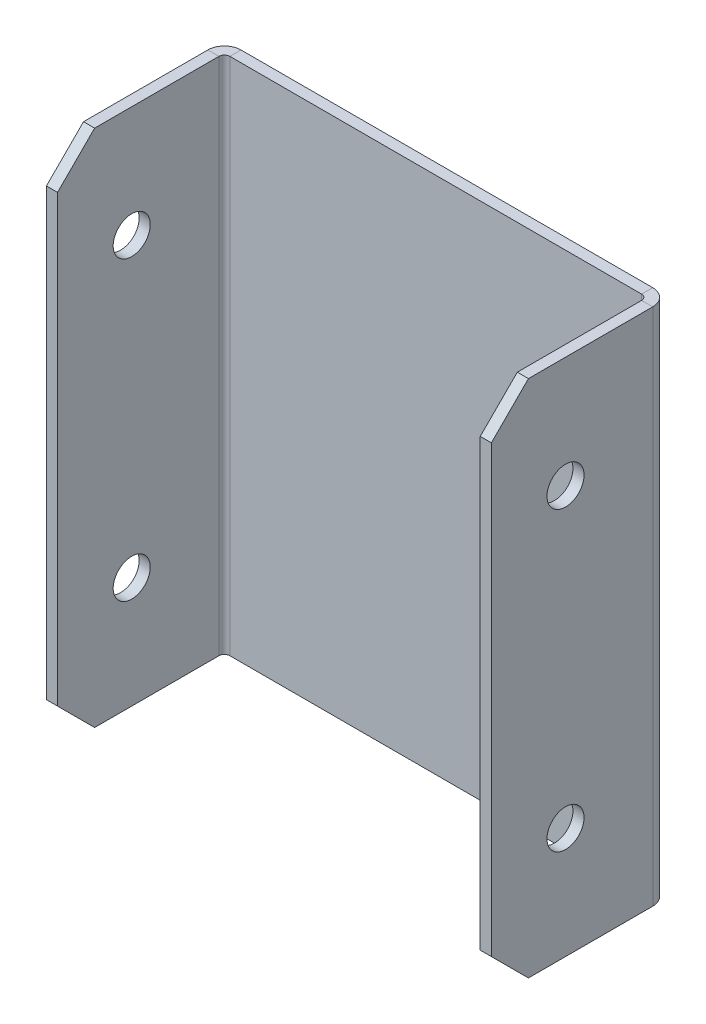
ISO-10303-21;
HEADER;
FILE_DESCRIPTION(('STEP AP214'),'2;1');
FILE_NAME('part.step','',(''),(''),'','','');
FILE_SCHEMA(('AUTOMOTIVE_DESIGN { 1 0 10303 214 1 1 1 1 }'));
ENDSEC;
DATA;
#1=APPLICATION_CONTEXT('core data for automotive mechanical design processes');
#2=APPLICATION_PROTOCOL_DEFINITION('international standard','automotive_design',2000,#1);
#3=PRODUCT_CONTEXT('',#1,'mechanical');
#4=PRODUCT('Part','Part','',(#3));
#5=PRODUCT_RELATED_PRODUCT_CATEGORY('part','',(#4));
#6=PRODUCT_DEFINITION_FORMATION('','',#4);
#7=PRODUCT_DEFINITION_CONTEXT('part definition',#1,'design');
#8=PRODUCT_DEFINITION('design','',#6,#7);
#9=PRODUCT_DEFINITION_SHAPE('','',#8);
#10=(LENGTH_UNIT() NAMED_UNIT(*) SI_UNIT(.MILLI.,.METRE.));
#11=(NAMED_UNIT(*) PLANE_ANGLE_UNIT() SI_UNIT($,.RADIAN.));
#12=(NAMED_UNIT(*) SI_UNIT($,.STERADIAN.) SOLID_ANGLE_UNIT());
#13=UNCERTAINTY_MEASURE_WITH_UNIT(LENGTH_MEASURE(1.E-05),#10,'distance_accuracy_value','');
#14=(GEOMETRIC_REPRESENTATION_CONTEXT(3) GLOBAL_UNCERTAINTY_ASSIGNED_CONTEXT((#13)) GLOBAL_UNIT_ASSIGNED_CONTEXT((#10,
#11,#12)) REPRESENTATION_CONTEXT('',''));
#15=CARTESIAN_POINT('',(0.,0.,0.));
#16=DIRECTION('',(0.,0.,1.));
#17=DIRECTION('',(1.,0.,0.));
#18=AXIS2_PLACEMENT_3D('',#15,#16,#17);
#19=CARTESIAN_POINT('',(0.,0.,-1.5));
#20=DIRECTION('',(0.,0.,-1.));
#21=DIRECTION('',(-1.,0.,0.));
#22=AXIS2_PLACEMENT_3D('',#19,#20,#21);
#23=PLANE('',#22);
#24=DIRECTION('',(-1.,0.,0.));
#25=VECTOR('',#24,1.);
#26=CARTESIAN_POINT('',(-30.,35.,-1.5));
#27=LINE('',#26,#25);
#28=CARTESIAN_POINT('',(27.7634,35.,-1.5));
#29=VERTEX_POINT('',#28);
#30=CARTESIAN_POINT('',(-27.7634,35.,-1.5));
#31=VERTEX_POINT('',#30);
#32=EDGE_CURVE('E310',#29,#31,#27,.T.);
#33=ORIENTED_EDGE('',*,*,#32,.F.);
#34=DIRECTION('',(0.,1.,0.));
#35=VECTOR('',#34,1.);
#36=CARTESIAN_POINT('',(27.7634,35.,-1.5));
#37=LINE('',#36,#35);
#38=CARTESIAN_POINT('',(27.7634,-35.,-1.5));
#39=VERTEX_POINT('',#38);
#40=EDGE_CURVE('E203',#29,#39,#37,.F.);
#41=ORIENTED_EDGE('',*,*,#40,.T.);
#42=DIRECTION('',(1.,0.,0.));
#43=VECTOR('',#42,1.);
#44=CARTESIAN_POINT('',(-30.,-35.,-1.5));
#45=LINE('',#44,#43);
#46=CARTESIAN_POINT('',(-27.7634,-35.,-1.5));
#47=VERTEX_POINT('',#46);
#48=EDGE_CURVE('E313',#47,#39,#45,.T.);
#49=ORIENTED_EDGE('',*,*,#48,.F.);
#50=DIRECTION('',(0.,-1.,0.));
#51=VECTOR('',#50,1.);
#52=CARTESIAN_POINT('',(-27.7634,-35.,-1.5));
#53=LINE('',#52,#51);
#54=EDGE_CURVE('E287',#47,#31,#53,.F.);
#55=ORIENTED_EDGE('',*,*,#54,.T.);
#56=EDGE_LOOP('',(#33,#41,#49,#55));
#57=FACE_BOUND('',#56,.T.);
#58=ADVANCED_FACE('F80',(#57),#23,.T.);
#59=CARTESIAN_POINT('',(0.,0.,0.));
#60=DIRECTION('',(0.,0.,-1.));
#61=DIRECTION('',(-1.,0.,0.));
#62=AXIS2_PLACEMENT_3D('',#59,#60,#61);
#63=PLANE('',#62);
#64=DIRECTION('',(0.,1.,0.));
#65=VECTOR('',#64,1.);
#66=CARTESIAN_POINT('',(27.7634,35.,0.));
#67=LINE('',#66,#65);
#68=CARTESIAN_POINT('',(27.7634,35.,0.));
#69=VERTEX_POINT('',#68);
#70=CARTESIAN_POINT('',(27.7634,-35.,0.));
#71=VERTEX_POINT('',#70);
#72=EDGE_CURVE('E254',#69,#71,#67,.F.);
#73=ORIENTED_EDGE('',*,*,#72,.F.);
#74=DIRECTION('',(-1.,0.,0.));
#75=VECTOR('',#74,1.);
#76=CARTESIAN_POINT('',(-30.,35.,0.));
#77=LINE('',#76,#75);
#78=CARTESIAN_POINT('',(-27.7634,35.,0.));
#79=VERTEX_POINT('',#78);
#80=EDGE_CURVE('E307',#69,#79,#77,.T.);
#81=ORIENTED_EDGE('',*,*,#80,.T.);
#82=DIRECTION('',(0.,-1.,0.));
#83=VECTOR('',#82,1.);
#84=CARTESIAN_POINT('',(-27.7634,-35.,0.));
#85=LINE('',#84,#83);
#86=CARTESIAN_POINT('',(-27.7634,-35.,0.));
#87=VERTEX_POINT('',#86);
#88=EDGE_CURVE('E300',#87,#79,#85,.F.);
#89=ORIENTED_EDGE('',*,*,#88,.F.);
#90=DIRECTION('',(1.,0.,0.));
#91=VECTOR('',#90,1.);
#92=CARTESIAN_POINT('',(-30.,-35.,0.));
#93=LINE('',#92,#91);
#94=EDGE_CURVE('E314',#87,#71,#93,.T.);
#95=ORIENTED_EDGE('',*,*,#94,.T.);
#96=EDGE_LOOP('',(#73,#81,#89,#95));
#97=FACE_BOUND('',#96,.T.);
#98=ADVANCED_FACE('F415',(#97),#63,.F.);
#99=CARTESIAN_POINT('',(-30.,35.,-1.5));
#100=DIRECTION('',(0.,1.,0.));
#101=DIRECTION('',(0.,0.,1.));
#102=AXIS2_PLACEMENT_3D('',#99,#100,#101);
#103=PLANE('',#102);
#104=ORIENTED_EDGE('',*,*,#80,.F.);
#105=DIRECTION('',(0.,0.,-1.));
#106=VECTOR('',#105,1.);
#107=CARTESIAN_POINT('',(27.7634,35.,0.));
#108=LINE('',#107,#106);
#109=EDGE_CURVE('E250',#69,#29,#108,.T.);
#110=ORIENTED_EDGE('',*,*,#109,.T.);
#111=ORIENTED_EDGE('',*,*,#32,.T.);
#112=DIRECTION('',(0.,0.,-1.));
#113=VECTOR('',#112,1.);
#114=CARTESIAN_POINT('',(-27.7634,35.,0.));
#115=LINE('',#114,#113);
#116=EDGE_CURVE('E304',#79,#31,#115,.T.);
#117=ORIENTED_EDGE('',*,*,#116,.F.);
#118=EDGE_LOOP('',(#104,#110,#111,#117));
#119=FACE_BOUND('',#118,.T.);
#120=ADVANCED_FACE('F421',(#119),#103,.T.);
#121=CARTESIAN_POINT('',(-30.,-35.,-1.5));
#122=DIRECTION('',(0.,-1.,0.));
#123=DIRECTION('',(0.,0.,-1.));
#124=AXIS2_PLACEMENT_3D('',#121,#122,#123);
#125=PLANE('',#124);
#126=DIRECTION('',(0.,0.,-1.));
#127=VECTOR('',#126,1.);
#128=CARTESIAN_POINT('',(27.7634,-35.,0.));
#129=LINE('',#128,#127);
#130=EDGE_CURVE('E257',#71,#39,#129,.T.);
#131=ORIENTED_EDGE('',*,*,#130,.F.);
#132=ORIENTED_EDGE('',*,*,#94,.F.);
#133=DIRECTION('',(0.,0.,-1.));
#134=VECTOR('',#133,1.);
#135=CARTESIAN_POINT('',(-27.7634,-35.,0.));
#136=LINE('',#135,#134);
#137=EDGE_CURVE('E294',#87,#47,#136,.T.);
#138=ORIENTED_EDGE('',*,*,#137,.T.);
#139=ORIENTED_EDGE('',*,*,#48,.T.);
#140=EDGE_LOOP('',(#131,#132,#138,#139));
#141=FACE_BOUND('',#140,.T.);
#142=ADVANCED_FACE('F429',(#141),#125,.T.);
#143=CARTESIAN_POINT('',(-27.7634,35.,0.7366));
#144=DIRECTION('',(0.,1.,0.));
#145=DIRECTION('',(0.,0.,1.));
#146=AXIS2_PLACEMENT_3D('',#143,#144,#145);
#147=PLANE('',#146);
#148=DIRECTION('',(1.,0.,0.));
#149=VECTOR('',#148,1.);
#150=CARTESIAN_POINT('',(-30.,35.,0.736599999999992));
#151=LINE('',#150,#149);
#152=CARTESIAN_POINT('',(-28.5,35.,0.736599999999997));
#153=VERTEX_POINT('',#152);
#154=CARTESIAN_POINT('',(-30.,35.,0.736599999999992));
#155=VERTEX_POINT('',#154);
#156=EDGE_CURVE('E260',#153,#155,#151,.F.);
#157=ORIENTED_EDGE('',*,*,#156,.F.);
#158=CARTESIAN_POINT('',(-27.7634,35.,0.7366));
#159=DIRECTION('',(0.,-1.,0.));
#160=DIRECTION('',(0.,0.,-1.));
#161=AXIS2_PLACEMENT_3D('',#158,#159,#160);
#162=CIRCLE('',#161,0.7366);
#163=EDGE_CURVE('E297',#79,#153,#162,.F.);
#164=ORIENTED_EDGE('',*,*,#163,.F.);
#165=ORIENTED_EDGE('',*,*,#116,.T.);
#166=CARTESIAN_POINT('',(-27.7634,35.,0.7366));
#167=DIRECTION('',(0.,-1.,0.));
#168=DIRECTION('',(0.,0.,-1.));
#169=AXIS2_PLACEMENT_3D('',#166,#167,#168);
#170=CIRCLE('',#169,2.2366);
#171=EDGE_CURVE('E290',#31,#155,#170,.F.);
#172=ORIENTED_EDGE('',*,*,#171,.T.);
#173=EDGE_LOOP('',(#157,#164,#165,#172));
#174=FACE_BOUND('',#173,.T.);
#175=ADVANCED_FACE('F432',(#174),#147,.T.);
#176=CARTESIAN_POINT('',(-27.7634,-35.,0.7366));
#177=DIRECTION('',(0.,1.,0.));
#178=DIRECTION('',(0.,0.,1.));
#179=AXIS2_PLACEMENT_3D('',#176,#177,#178);
#180=PLANE('',#179);
#181=CARTESIAN_POINT('',(-27.7634,-35.,0.7366));
#182=DIRECTION('',(0.,-1.,0.));
#183=DIRECTION('',(0.,0.,-1.));
#184=AXIS2_PLACEMENT_3D('',#181,#182,#183);
#185=CIRCLE('',#184,0.7366);
#186=CARTESIAN_POINT('',(-28.5,-35.,0.736599999999997));
#187=VERTEX_POINT('',#186);
#188=EDGE_CURVE('E264',#187,#87,#185,.T.);
#189=ORIENTED_EDGE('',*,*,#188,.F.);
#190=DIRECTION('',(1.,0.,0.));
#191=VECTOR('',#190,1.);
#192=CARTESIAN_POINT('',(-28.5,-35.,0.736599999999997));
#193=LINE('',#192,#191);
#194=CARTESIAN_POINT('',(-30.,-35.,0.736599999999992));
#195=VERTEX_POINT('',#194);
#196=EDGE_CURVE('E280',#187,#195,#193,.F.);
#197=ORIENTED_EDGE('',*,*,#196,.T.);
#198=CARTESIAN_POINT('',(-27.7634,-35.,0.7366));
#199=DIRECTION('',(0.,-1.,0.));
#200=DIRECTION('',(0.,0.,-1.));
#201=AXIS2_PLACEMENT_3D('',#198,#199,#200);
#202=CIRCLE('',#201,2.2366);
#203=EDGE_CURVE('E291',#195,#47,#202,.T.);
#204=ORIENTED_EDGE('',*,*,#203,.T.);
#205=ORIENTED_EDGE('',*,*,#137,.F.);
#206=EDGE_LOOP('',(#189,#197,#204,#205));
#207=FACE_BOUND('',#206,.T.);
#208=ADVANCED_FACE('F426',(#207),#180,.F.);
#209=CARTESIAN_POINT('',(-27.7634,-35.,0.7366));
#210=DIRECTION('',(0.,-1.,0.));
#211=DIRECTION('',(-1.,0.,0.));
#212=AXIS2_PLACEMENT_3D('',#209,#210,#211);
#213=CYLINDRICAL_SURFACE('',#212,2.2366);
#214=ORIENTED_EDGE('',*,*,#54,.F.);
#215=ORIENTED_EDGE('',*,*,#203,.F.);
#216=DIRECTION('',(0.,-1.,0.));
#217=VECTOR('',#216,1.);
#218=CARTESIAN_POINT('',(-30.,35.,0.736599999999992));
#219=LINE('',#218,#217);
#220=EDGE_CURVE('E277',#195,#155,#219,.F.);
#221=ORIENTED_EDGE('',*,*,#220,.T.);
#222=ORIENTED_EDGE('',*,*,#171,.F.);
#223=EDGE_LOOP('',(#214,#215,#221,#222));
#224=FACE_BOUND('',#223,.T.);
#225=ADVANCED_FACE('F462',(#224),#213,.T.);
#226=CARTESIAN_POINT('',(-27.7634,-35.,0.7366));
#227=DIRECTION('',(0.,-1.,0.));
#228=DIRECTION('',(-1.,0.,0.));
#229=AXIS2_PLACEMENT_3D('',#226,#227,#228);
#230=CYLINDRICAL_SURFACE('',#229,0.7366);
#231=ORIENTED_EDGE('',*,*,#88,.T.);
#232=ORIENTED_EDGE('',*,*,#163,.T.);
#233=DIRECTION('',(0.,-1.,0.));
#234=VECTOR('',#233,1.);
#235=CARTESIAN_POINT('',(-28.5,35.,0.736599999999997));
#236=LINE('',#235,#234);
#237=EDGE_CURVE('E283',#153,#187,#236,.T.);
#238=ORIENTED_EDGE('',*,*,#237,.T.);
#239=ORIENTED_EDGE('',*,*,#188,.T.);
#240=EDGE_LOOP('',(#231,#232,#238,#239));
#241=FACE_BOUND('',#240,.T.);
#242=ADVANCED_FACE('F482',(#241),#230,.F.);
#243=CARTESIAN_POINT('',(-30.0000000000001,-35.,22.5));
#244=DIRECTION('',(0.,1.,0.));
#245=DIRECTION('',(0.,0.,1.));
#246=AXIS2_PLACEMENT_3D('',#243,#244,#245);
#247=PLANE('',#246);
#248=DIRECTION('',(0.,0.,-1.));
#249=VECTOR('',#248,1.);
#250=CARTESIAN_POINT('',(-28.5000000000001,-35.,22.5));
#251=LINE('',#250,#249);
#252=CARTESIAN_POINT('',(-28.5000000000001,-35.,17.5));
#253=VERTEX_POINT('',#252);
#254=EDGE_CURVE('E274',#187,#253,#251,.F.);
#255=ORIENTED_EDGE('',*,*,#254,.T.);
#256=DIRECTION('',(-1.,0.,0.));
#257=VECTOR('',#256,1.);
#258=CARTESIAN_POINT('',(-30.0000000000001,-35.,17.5));
#259=LINE('',#258,#257);
#260=CARTESIAN_POINT('',(-30.0000000000001,-35.,17.5));
#261=VERTEX_POINT('',#260);
#262=EDGE_CURVE('E326',#253,#261,#259,.T.);
#263=ORIENTED_EDGE('',*,*,#262,.T.);
#264=DIRECTION('',(0.,0.,1.));
#265=VECTOR('',#264,1.);
#266=CARTESIAN_POINT('',(-30.,-35.,-1.11633595201509E-13));
#267=LINE('',#266,#265);
#268=EDGE_CURVE('E267',#195,#261,#267,.T.);
#269=ORIENTED_EDGE('',*,*,#268,.F.);
#270=ORIENTED_EDGE('',*,*,#196,.F.);
#271=EDGE_LOOP('',(#255,#263,#269,#270));
#272=FACE_BOUND('',#271,.T.);
#273=ADVANCED_FACE('F474',(#272),#247,.F.);
#274=CARTESIAN_POINT('',(-30.,35.,0.));
#275=DIRECTION('',(0.,-1.,0.));
#276=DIRECTION('',(0.,0.,-1.));
#277=AXIS2_PLACEMENT_3D('',#274,#275,#276);
#278=PLANE('',#277);
#279=DIRECTION('',(0.,0.,-1.));
#280=VECTOR('',#279,1.);
#281=CARTESIAN_POINT('',(-30.,35.,-1.11633595201509E-13));
#282=LINE('',#281,#280);
#283=CARTESIAN_POINT('',(-30.0000000000001,35.,17.5));
#284=VERTEX_POINT('',#283);
#285=EDGE_CURVE('E262',#284,#155,#282,.T.);
#286=ORIENTED_EDGE('',*,*,#285,.F.);
#287=DIRECTION('',(1.,0.,0.));
#288=VECTOR('',#287,1.);
#289=CARTESIAN_POINT('',(-30.0000000000001,35.,17.5));
#290=LINE('',#289,#288);
#291=CARTESIAN_POINT('',(-28.5000000000001,35.,17.5));
#292=VERTEX_POINT('',#291);
#293=EDGE_CURVE('E349',#284,#292,#290,.T.);
#294=ORIENTED_EDGE('',*,*,#293,.T.);
#295=DIRECTION('',(0.,0.,1.));
#296=VECTOR('',#295,1.);
#297=CARTESIAN_POINT('',(-28.5,35.,0.));
#298=LINE('',#297,#296);
#299=EDGE_CURVE('E270',#292,#153,#298,.F.);
#300=ORIENTED_EDGE('',*,*,#299,.T.);
#301=ORIENTED_EDGE('',*,*,#156,.T.);
#302=EDGE_LOOP('',(#286,#294,#300,#301));
#303=FACE_BOUND('',#302,.T.);
#304=ADVANCED_FACE('F487',(#303),#278,.F.);
#305=CARTESIAN_POINT('',(-30.,0.,-1.11633595201509E-13));
#306=DIRECTION('',(1.,0.,0.));
#307=DIRECTION('',(0.,0.,-1.));
#308=AXIS2_PLACEMENT_3D('',#305,#306,#307);
#309=PLANE('',#308);
#310=CARTESIAN_POINT('',(-30.0000000000001,-20.,12.5000000000002));
#311=DIRECTION('',(1.,0.,0.));
#312=DIRECTION('',(0.,0.,-1.));
#313=AXIS2_PLACEMENT_3D('',#310,#311,#312);
#314=CIRCLE('',#313,2.5);
#315=CARTESIAN_POINT('',(-30.0000000000001,-20.,10.0000000000002));
#316=VERTEX_POINT('',#315);
#317=EDGE_CURVE('E356',#316,#316,#314,.T.);
#318=ORIENTED_EDGE('',*,*,#317,.T.);
#319=EDGE_LOOP('',(#318));
#320=FACE_BOUND('',#319,.T.);
#321=CARTESIAN_POINT('',(-30.0000000000001,20.,12.5000000000002));
#322=DIRECTION('',(1.,0.,0.));
#323=DIRECTION('',(0.,0.,-1.));
#324=AXIS2_PLACEMENT_3D('',#321,#322,#323);
#325=CIRCLE('',#324,2.5);
#326=CARTESIAN_POINT('',(-30.0000000000001,20.,10.0000000000002));
#327=VERTEX_POINT('',#326);
#328=EDGE_CURVE('E367',#327,#327,#325,.T.);
#329=ORIENTED_EDGE('',*,*,#328,.T.);
#330=EDGE_LOOP('',(#329));
#331=FACE_BOUND('',#330,.T.);
#332=DIRECTION('',(0.,1.,0.));
#333=VECTOR('',#332,1.);
#334=CARTESIAN_POINT('',(-30.0000000000001,0.,22.5));
#335=LINE('',#334,#333);
#336=CARTESIAN_POINT('',(-30.0000000000001,-30.,22.5));
#337=VERTEX_POINT('',#336);
#338=CARTESIAN_POINT('',(-30.0000000000001,30.,22.5));
#339=VERTEX_POINT('',#338);
#340=EDGE_CURVE('E265',#337,#339,#335,.T.);
#341=ORIENTED_EDGE('',*,*,#340,.T.);
#342=DIRECTION('',(0.,-0.707106781186548,0.707106781186548));
#343=VECTOR('',#342,1.);
#344=CARTESIAN_POINT('',(-30.0000000000001,35.,17.5));
#345=LINE('',#344,#343);
#346=EDGE_CURVE('E13',#339,#284,#345,.F.);
#347=ORIENTED_EDGE('',*,*,#346,.T.);
#348=ORIENTED_EDGE('',*,*,#285,.T.);
#349=ORIENTED_EDGE('',*,*,#220,.F.);
#350=ORIENTED_EDGE('',*,*,#268,.T.);
#351=DIRECTION('',(0.,-0.707106781186547,-0.707106781186548));
#352=VECTOR('',#351,1.);
#353=CARTESIAN_POINT('',(-30.0000000000001,-30.,22.5));
#354=LINE('',#353,#352);
#355=EDGE_CURVE('E328',#261,#337,#354,.F.);
#356=ORIENTED_EDGE('',*,*,#355,.T.);
#357=EDGE_LOOP('',(#341,#347,#348,#349,#350,#356));
#358=FACE_BOUND('',#357,.T.);
#359=ADVANCED_FACE('F471',(#320,#331,#358),#309,.F.);
#360=CARTESIAN_POINT('',(-28.5,0.,-1.06396373193244E-13));
#361=DIRECTION('',(1.,0.,0.));
#362=DIRECTION('',(0.,0.,-1.));
#363=AXIS2_PLACEMENT_3D('',#360,#361,#362);
#364=PLANE('',#363);
#365=CARTESIAN_POINT('',(-28.5000000000001,-20.,12.5000000000002));
#366=DIRECTION('',(1.,0.,0.));
#367=DIRECTION('',(0.,0.,-1.));
#368=AXIS2_PLACEMENT_3D('',#365,#366,#367);
#369=CIRCLE('',#368,2.5);
#370=CARTESIAN_POINT('',(-28.5,-20.,10.0000000000002));
#371=VERTEX_POINT('',#370);
#372=EDGE_CURVE('E247',#371,#371,#369,.T.);
#373=ORIENTED_EDGE('',*,*,#372,.F.);
#374=EDGE_LOOP('',(#373));
#375=FACE_BOUND('',#374,.T.);
#376=CARTESIAN_POINT('',(-28.5000000000001,20.,12.5000000000002));
#377=DIRECTION('',(1.,0.,0.));
#378=DIRECTION('',(0.,0.,-1.));
#379=AXIS2_PLACEMENT_3D('',#376,#377,#378);
#380=CIRCLE('',#379,2.5);
#381=CARTESIAN_POINT('',(-28.5,20.,10.0000000000002));
#382=VERTEX_POINT('',#381);
#383=EDGE_CURVE('E355',#382,#382,#380,.T.);
#384=ORIENTED_EDGE('',*,*,#383,.F.);
#385=EDGE_LOOP('',(#384));
#386=FACE_BOUND('',#385,.T.);
#387=ORIENTED_EDGE('',*,*,#299,.F.);
#388=DIRECTION('',(0.,0.707106781186548,-0.707106781186548));
#389=VECTOR('',#388,1.);
#390=CARTESIAN_POINT('',(-28.5000000000001,26.25,26.2499999999999));
#391=LINE('',#390,#389);
#392=CARTESIAN_POINT('',(-28.5000000000001,30.,22.5));
#393=VERTEX_POINT('',#392);
#394=EDGE_CURVE('E105',#292,#393,#391,.F.);
#395=ORIENTED_EDGE('',*,*,#394,.T.);
#396=DIRECTION('',(0.,-1.,0.));
#397=VECTOR('',#396,1.);
#398=CARTESIAN_POINT('',(-28.5000000000001,35.,22.5));
#399=LINE('',#398,#397);
#400=CARTESIAN_POINT('',(-28.5000000000001,-30.,22.5));
#401=VERTEX_POINT('',#400);
#402=EDGE_CURVE('E272',#401,#393,#399,.F.);
#403=ORIENTED_EDGE('',*,*,#402,.F.);
#404=DIRECTION('',(0.,0.707106781186547,0.707106781186548));
#405=VECTOR('',#404,1.);
#406=CARTESIAN_POINT('',(-28.5000000000001,-26.2500000000001,26.2499999999999));
#407=LINE('',#406,#405);
#408=EDGE_CURVE('E324',#401,#253,#407,.F.);
#409=ORIENTED_EDGE('',*,*,#408,.T.);
#410=ORIENTED_EDGE('',*,*,#254,.F.);
#411=ORIENTED_EDGE('',*,*,#237,.F.);
#412=EDGE_LOOP('',(#387,#395,#403,#409,#410,#411));
#413=FACE_BOUND('',#412,.T.);
#414=ADVANCED_FACE('F479',(#375,#386,#413),#364,.T.);
#415=CARTESIAN_POINT('',(-30.0000000000001,35.,22.5));
#416=DIRECTION('',(0.,0.,-1.));
#417=DIRECTION('',(-1.,0.,0.));
#418=AXIS2_PLACEMENT_3D('',#415,#416,#417);
#419=PLANE('',#418);
#420=ORIENTED_EDGE('',*,*,#402,.T.);
#421=DIRECTION('',(-1.,0.,0.));
#422=VECTOR('',#421,1.);
#423=CARTESIAN_POINT('',(-30.0000000000001,30.,22.5));
#424=LINE('',#423,#422);
#425=EDGE_CURVE('E90',#393,#339,#424,.T.);
#426=ORIENTED_EDGE('',*,*,#425,.T.);
#427=ORIENTED_EDGE('',*,*,#340,.F.);
#428=DIRECTION('',(1.,0.,0.));
#429=VECTOR('',#428,1.);
#430=CARTESIAN_POINT('',(-30.0000000000001,-30.,22.5));
#431=LINE('',#430,#429);
#432=EDGE_CURVE('E317',#337,#401,#431,.T.);
#433=ORIENTED_EDGE('',*,*,#432,.T.);
#434=EDGE_LOOP('',(#420,#426,#427,#433));
#435=FACE_BOUND('',#434,.T.);
#436=ADVANCED_FACE('F478',(#435),#419,.F.);
#437=CARTESIAN_POINT('',(27.7634,-35.,0.736599999999999));
#438=DIRECTION('',(0.,-1.,0.));
#439=DIRECTION('',(0.,0.,-1.));
#440=AXIS2_PLACEMENT_3D('',#437,#438,#439);
#441=PLANE('',#440);
#442=DIRECTION('',(-1.,0.,0.));
#443=VECTOR('',#442,1.);
#444=CARTESIAN_POINT('',(30.,-35.,0.736599999999992));
#445=LINE('',#444,#443);
#446=CARTESIAN_POINT('',(28.5,-35.,0.736599999999996));
#447=VERTEX_POINT('',#446);
#448=CARTESIAN_POINT('',(30.,-35.,0.736599999999991));
#449=VERTEX_POINT('',#448);
#450=EDGE_CURVE('E244',#447,#449,#445,.F.);
#451=ORIENTED_EDGE('',*,*,#450,.F.);
#452=CARTESIAN_POINT('',(27.7634,-35.,0.736599999999999));
#453=DIRECTION('',(0.,1.,0.));
#454=DIRECTION('',(0.,0.,1.));
#455=AXIS2_PLACEMENT_3D('',#452,#453,#454);
#456=CIRCLE('',#455,0.7366);
#457=EDGE_CURVE('E206',#71,#447,#456,.F.);
#458=ORIENTED_EDGE('',*,*,#457,.F.);
#459=ORIENTED_EDGE('',*,*,#130,.T.);
#460=CARTESIAN_POINT('',(27.7634,-35.,0.736599999999999));
#461=DIRECTION('',(0.,1.,0.));
#462=DIRECTION('',(0.,0.,1.));
#463=AXIS2_PLACEMENT_3D('',#460,#461,#462);
#464=CIRCLE('',#463,2.2366);
#465=EDGE_CURVE('E249',#39,#449,#464,.F.);
#466=ORIENTED_EDGE('',*,*,#465,.T.);
#467=EDGE_LOOP('',(#451,#458,#459,#466));
#468=FACE_BOUND('',#467,.T.);
#469=ADVANCED_FACE('F459',(#468),#441,.T.);
#470=CARTESIAN_POINT('',(27.7634,35.,0.736600000000004));
#471=DIRECTION('',(0.,-1.,0.));
#472=DIRECTION('',(0.,0.,-1.));
#473=AXIS2_PLACEMENT_3D('',#470,#471,#472);
#474=PLANE('',#473);
#475=CARTESIAN_POINT('',(27.7634,35.,0.736600000000004));
#476=DIRECTION('',(0.,1.,0.));
#477=DIRECTION('',(0.,0.,1.));
#478=AXIS2_PLACEMENT_3D('',#475,#476,#477);
#479=CIRCLE('',#478,0.7366);
#480=CARTESIAN_POINT('',(28.5,35.,0.736600000000001));
#481=VERTEX_POINT('',#480);
#482=EDGE_CURVE('E213',#481,#69,#479,.T.);
#483=ORIENTED_EDGE('',*,*,#482,.F.);
#484=DIRECTION('',(-1.,0.,0.));
#485=VECTOR('',#484,1.);
#486=CARTESIAN_POINT('',(28.5,35.,0.7366));
#487=LINE('',#486,#485);
#488=CARTESIAN_POINT('',(30.,35.,0.736599999999995));
#489=VERTEX_POINT('',#488);
#490=EDGE_CURVE('E210',#481,#489,#487,.F.);
#491=ORIENTED_EDGE('',*,*,#490,.T.);
#492=CARTESIAN_POINT('',(27.7634,35.,0.736600000000004));
#493=DIRECTION('',(0.,1.,0.));
#494=DIRECTION('',(0.,0.,1.));
#495=AXIS2_PLACEMENT_3D('',#492,#493,#494);
#496=CIRCLE('',#495,2.2366);
#497=EDGE_CURVE('E196',#489,#29,#496,.T.);
#498=ORIENTED_EDGE('',*,*,#497,.T.);
#499=ORIENTED_EDGE('',*,*,#109,.F.);
#500=EDGE_LOOP('',(#483,#491,#498,#499));
#501=FACE_BOUND('',#500,.T.);
#502=ADVANCED_FACE('F211',(#501),#474,.F.);
#503=CARTESIAN_POINT('',(27.7634,35.,0.736600000000004));
#504=DIRECTION('',(0.,1.,0.));
#505=DIRECTION('',(1.,0.,0.));
#506=AXIS2_PLACEMENT_3D('',#503,#504,#505);
#507=CYLINDRICAL_SURFACE('',#506,2.2366);
#508=ORIENTED_EDGE('',*,*,#40,.F.);
#509=ORIENTED_EDGE('',*,*,#497,.F.);
#510=DIRECTION('',(0.,1.,0.));
#511=VECTOR('',#510,1.);
#512=CARTESIAN_POINT('',(30.,-35.,0.736599999999992));
#513=LINE('',#512,#511);
#514=EDGE_CURVE('E200',#489,#449,#513,.F.);
#515=ORIENTED_EDGE('',*,*,#514,.T.);
#516=ORIENTED_EDGE('',*,*,#465,.F.);
#517=EDGE_LOOP('',(#508,#509,#515,#516));
#518=FACE_BOUND('',#517,.T.);
#519=ADVANCED_FACE('F198',(#518),#507,.T.);
#520=CARTESIAN_POINT('',(27.7634,35.,0.736600000000004));
#521=DIRECTION('',(0.,1.,0.));
#522=DIRECTION('',(1.,0.,0.));
#523=AXIS2_PLACEMENT_3D('',#520,#521,#522);
#524=CYLINDRICAL_SURFACE('',#523,0.7366);
#525=ORIENTED_EDGE('',*,*,#72,.T.);
#526=ORIENTED_EDGE('',*,*,#457,.T.);
#527=DIRECTION('',(0.,1.,0.));
#528=VECTOR('',#527,1.);
#529=CARTESIAN_POINT('',(28.5,-35.,0.736599999999997));
#530=LINE('',#529,#528);
#531=EDGE_CURVE('E218',#447,#481,#530,.T.);
#532=ORIENTED_EDGE('',*,*,#531,.T.);
#533=ORIENTED_EDGE('',*,*,#482,.T.);
#534=EDGE_LOOP('',(#525,#526,#532,#533));
#535=FACE_BOUND('',#534,.T.);
#536=ADVANCED_FACE('F455',(#535),#524,.F.);
#537=CARTESIAN_POINT('',(30.,-35.,0.));
#538=DIRECTION('',(0.,1.,0.));
#539=DIRECTION('',(0.,0.,1.));
#540=AXIS2_PLACEMENT_3D('',#537,#538,#539);
#541=PLANE('',#540);
#542=DIRECTION('',(0.,0.,-1.));
#543=VECTOR('',#542,1.);
#544=CARTESIAN_POINT('',(30.,-35.,-1.11633595201509E-13));
#545=LINE('',#544,#543);
#546=CARTESIAN_POINT('',(30.,-35.,17.5));
#547=VERTEX_POINT('',#546);
#548=EDGE_CURVE('E226',#547,#449,#545,.T.);
#549=ORIENTED_EDGE('',*,*,#548,.F.);
#550=DIRECTION('',(-1.,0.,0.));
#551=VECTOR('',#550,1.);
#552=CARTESIAN_POINT('',(30.,-35.,17.5));
#553=LINE('',#552,#551);
#554=CARTESIAN_POINT('',(28.5,-35.,17.5));
#555=VERTEX_POINT('',#554);
#556=EDGE_CURVE('E330',#547,#555,#553,.T.);
#557=ORIENTED_EDGE('',*,*,#556,.T.);
#558=DIRECTION('',(0.,0.,1.));
#559=VECTOR('',#558,1.);
#560=CARTESIAN_POINT('',(28.5,-35.,0.));
#561=LINE('',#560,#559);
#562=EDGE_CURVE('E227',#555,#447,#561,.F.);
#563=ORIENTED_EDGE('',*,*,#562,.T.);
#564=ORIENTED_EDGE('',*,*,#450,.T.);
#565=EDGE_LOOP('',(#549,#557,#563,#564));
#566=FACE_BOUND('',#565,.T.);
#567=ADVANCED_FACE('F401',(#566),#541,.F.);
#568=CARTESIAN_POINT('',(30.0000000000001,35.,22.5));
#569=DIRECTION('',(0.,-1.,0.));
#570=DIRECTION('',(0.,0.,-1.));
#571=AXIS2_PLACEMENT_3D('',#568,#569,#570);
#572=PLANE('',#571);
#573=DIRECTION('',(0.,0.,-1.));
#574=VECTOR('',#573,1.);
#575=CARTESIAN_POINT('',(28.5000000000001,35.,22.5));
#576=LINE('',#575,#574);
#577=CARTESIAN_POINT('',(28.5,35.,17.5));
#578=VERTEX_POINT('',#577);
#579=EDGE_CURVE('E240',#481,#578,#576,.F.);
#580=ORIENTED_EDGE('',*,*,#579,.T.);
#581=DIRECTION('',(1.,0.,0.));
#582=VECTOR('',#581,1.);
#583=CARTESIAN_POINT('',(30.,35.,17.5));
#584=LINE('',#583,#582);
#585=CARTESIAN_POINT('',(30.,35.,17.5));
#586=VERTEX_POINT('',#585);
#587=EDGE_CURVE('E231',#578,#586,#584,.T.);
#588=ORIENTED_EDGE('',*,*,#587,.T.);
#589=DIRECTION('',(0.,0.,1.));
#590=VECTOR('',#589,1.);
#591=CARTESIAN_POINT('',(30.,35.,-1.11633595201509E-13));
#592=LINE('',#591,#590);
#593=EDGE_CURVE('E223',#489,#586,#592,.T.);
#594=ORIENTED_EDGE('',*,*,#593,.F.);
#595=ORIENTED_EDGE('',*,*,#490,.F.);
#596=EDGE_LOOP('',(#580,#588,#594,#595));
#597=FACE_BOUND('',#596,.T.);
#598=ADVANCED_FACE('F229',(#597),#572,.F.);
#599=CARTESIAN_POINT('',(30.,0.,-1.11633595201509E-13));
#600=DIRECTION('',(-1.,0.,0.));
#601=DIRECTION('',(0.,0.,1.));
#602=AXIS2_PLACEMENT_3D('',#599,#600,#601);
#603=PLANE('',#602);
#604=CARTESIAN_POINT('',(30.,-20.,12.5));
#605=DIRECTION('',(1.,0.,0.));
#606=DIRECTION('',(0.,0.,-1.));
#607=AXIS2_PLACEMENT_3D('',#604,#605,#606);
#608=CIRCLE('',#607,2.5);
#609=CARTESIAN_POINT('',(30.,-20.,9.99999999999999));
#610=VERTEX_POINT('',#609);
#611=EDGE_CURVE('E362',#610,#610,#608,.T.);
#612=ORIENTED_EDGE('',*,*,#611,.F.);
#613=EDGE_LOOP('',(#612));
#614=FACE_BOUND('',#613,.T.);
#615=CARTESIAN_POINT('',(30.,20.,12.5));
#616=DIRECTION('',(1.,0.,0.));
#617=DIRECTION('',(0.,0.,-1.));
#618=AXIS2_PLACEMENT_3D('',#615,#616,#617);
#619=CIRCLE('',#618,2.5);
#620=CARTESIAN_POINT('',(30.,20.,9.99999999999999));
#621=VERTEX_POINT('',#620);
#622=EDGE_CURVE('E372',#621,#621,#619,.T.);
#623=ORIENTED_EDGE('',*,*,#622,.F.);
#624=EDGE_LOOP('',(#623));
#625=FACE_BOUND('',#624,.T.);
#626=ORIENTED_EDGE('',*,*,#593,.T.);
#627=DIRECTION('',(0.,0.707106781186547,-0.707106781186548));
#628=VECTOR('',#627,1.);
#629=CARTESIAN_POINT('',(30.0000000000001,30.,22.5));
#630=LINE('',#629,#628);
#631=CARTESIAN_POINT('',(30.0000000000001,30.,22.5));
#632=VERTEX_POINT('',#631);
#633=EDGE_CURVE('E347',#586,#632,#630,.F.);
#634=ORIENTED_EDGE('',*,*,#633,.T.);
#635=DIRECTION('',(0.,-1.,0.));
#636=VECTOR('',#635,1.);
#637=CARTESIAN_POINT('',(30.0000000000001,0.,22.5));
#638=LINE('',#637,#636);
#639=CARTESIAN_POINT('',(30.0000000000001,-30.,22.5));
#640=VERTEX_POINT('',#639);
#641=EDGE_CURVE('E232',#632,#640,#638,.T.);
#642=ORIENTED_EDGE('',*,*,#641,.T.);
#643=DIRECTION('',(0.,0.707106781186548,0.707106781186548));
#644=VECTOR('',#643,1.);
#645=CARTESIAN_POINT('',(30.,-35.,17.5));
#646=LINE('',#645,#644);
#647=EDGE_CURVE('E339',#640,#547,#646,.F.);
#648=ORIENTED_EDGE('',*,*,#647,.T.);
#649=ORIENTED_EDGE('',*,*,#548,.T.);
#650=ORIENTED_EDGE('',*,*,#514,.F.);
#651=EDGE_LOOP('',(#626,#634,#642,#648,#649,#650));
#652=FACE_BOUND('',#651,.T.);
#653=ADVANCED_FACE('F222',(#614,#625,#652),#603,.F.);
#654=CARTESIAN_POINT('',(28.5,0.,-1.06396373193244E-13));
#655=DIRECTION('',(-1.,0.,0.));
#656=DIRECTION('',(0.,0.,1.));
#657=AXIS2_PLACEMENT_3D('',#654,#655,#656);
#658=PLANE('',#657);
#659=CARTESIAN_POINT('',(28.5,-20.,12.5));
#660=DIRECTION('',(-1.,0.,0.));
#661=DIRECTION('',(0.,0.,1.));
#662=AXIS2_PLACEMENT_3D('',#659,#660,#661);
#663=CIRCLE('',#662,2.5);
#664=CARTESIAN_POINT('',(28.5,-20.,15.));
#665=VERTEX_POINT('',#664);
#666=EDGE_CURVE('E85',#665,#665,#663,.T.);
#667=ORIENTED_EDGE('',*,*,#666,.F.);
#668=EDGE_LOOP('',(#667));
#669=FACE_BOUND('',#668,.T.);
#670=CARTESIAN_POINT('',(28.5,20.,12.5));
#671=DIRECTION('',(-1.,0.,0.));
#672=DIRECTION('',(0.,0.,1.));
#673=AXIS2_PLACEMENT_3D('',#670,#671,#672);
#674=CIRCLE('',#673,2.5);
#675=CARTESIAN_POINT('',(28.5,20.,15.));
#676=VERTEX_POINT('',#675);
#677=EDGE_CURVE('E353',#676,#676,#674,.T.);
#678=ORIENTED_EDGE('',*,*,#677,.F.);
#679=EDGE_LOOP('',(#678));
#680=FACE_BOUND('',#679,.T.);
#681=DIRECTION('',(0.,1.,0.));
#682=VECTOR('',#681,1.);
#683=CARTESIAN_POINT('',(28.5000000000001,-35.,22.5));
#684=LINE('',#683,#682);
#685=CARTESIAN_POINT('',(28.5000000000001,30.,22.5));
#686=VERTEX_POINT('',#685);
#687=CARTESIAN_POINT('',(28.5000000000001,-30.,22.5));
#688=VERTEX_POINT('',#687);
#689=EDGE_CURVE('E235',#686,#688,#684,.F.);
#690=ORIENTED_EDGE('',*,*,#689,.F.);
#691=DIRECTION('',(0.,-0.707106781186547,0.707106781186548));
#692=VECTOR('',#691,1.);
#693=CARTESIAN_POINT('',(28.5000000000001,26.25,26.2499999999999));
#694=LINE('',#693,#692);
#695=EDGE_CURVE('E344',#686,#578,#694,.F.);
#696=ORIENTED_EDGE('',*,*,#695,.T.);
#697=ORIENTED_EDGE('',*,*,#579,.F.);
#698=ORIENTED_EDGE('',*,*,#531,.F.);
#699=ORIENTED_EDGE('',*,*,#562,.F.);
#700=DIRECTION('',(0.,-0.707106781186548,-0.707106781186548));
#701=VECTOR('',#700,1.);
#702=CARTESIAN_POINT('',(28.5000000000001,-26.25,26.2499999999999));
#703=LINE('',#702,#701);
#704=EDGE_CURVE('E333',#555,#688,#703,.F.);
#705=ORIENTED_EDGE('',*,*,#704,.T.);
#706=EDGE_LOOP('',(#690,#696,#697,#698,#699,#705));
#707=FACE_BOUND('',#706,.T.);
#708=ADVANCED_FACE('F383',(#669,#680,#707),#658,.T.);
#709=CARTESIAN_POINT('',(30.0000000000001,-35.,22.5));
#710=DIRECTION('',(0.,0.,-1.));
#711=DIRECTION('',(-1.,0.,0.));
#712=AXIS2_PLACEMENT_3D('',#709,#710,#711);
#713=PLANE('',#712);
#714=ORIENTED_EDGE('',*,*,#641,.F.);
#715=DIRECTION('',(-1.,0.,0.));
#716=VECTOR('',#715,1.);
#717=CARTESIAN_POINT('',(30.0000000000001,30.,22.5));
#718=LINE('',#717,#716);
#719=EDGE_CURVE('E341',#632,#686,#718,.T.);
#720=ORIENTED_EDGE('',*,*,#719,.T.);
#721=ORIENTED_EDGE('',*,*,#689,.T.);
#722=DIRECTION('',(1.,0.,0.));
#723=VECTOR('',#722,1.);
#724=CARTESIAN_POINT('',(30.0000000000001,-30.,22.5));
#725=LINE('',#724,#723);
#726=EDGE_CURVE('E336',#688,#640,#725,.T.);
#727=ORIENTED_EDGE('',*,*,#726,.T.);
#728=EDGE_LOOP('',(#714,#720,#721,#727));
#729=FACE_BOUND('',#728,.T.);
#730=ADVANCED_FACE('F386',(#729),#713,.F.);
#731=CARTESIAN_POINT('',(-30.0000000000001,-30.,22.5));
#732=DIRECTION('',(0.,0.707106781186548,-0.707106781186547));
#733=DIRECTION('',(1.,0.,0.));
#734=AXIS2_PLACEMENT_3D('',#731,#732,#733);
#735=PLANE('',#734);
#736=ORIENTED_EDGE('',*,*,#355,.F.);
#737=ORIENTED_EDGE('',*,*,#262,.F.);
#738=ORIENTED_EDGE('',*,*,#408,.F.);
#739=ORIENTED_EDGE('',*,*,#432,.F.);
#740=EDGE_LOOP('',(#736,#737,#738,#739));
#741=FACE_BOUND('',#740,.T.);
#742=ADVANCED_FACE('F405',(#741),#735,.F.);
#743=CARTESIAN_POINT('',(30.,-35.,17.5));
#744=DIRECTION('',(0.,0.707106781186547,-0.707106781186547));
#745=DIRECTION('',(-1.,0.,0.));
#746=AXIS2_PLACEMENT_3D('',#743,#744,#745);
#747=PLANE('',#746);
#748=ORIENTED_EDGE('',*,*,#647,.F.);
#749=ORIENTED_EDGE('',*,*,#726,.F.);
#750=ORIENTED_EDGE('',*,*,#704,.F.);
#751=ORIENTED_EDGE('',*,*,#556,.F.);
#752=EDGE_LOOP('',(#748,#749,#750,#751));
#753=FACE_BOUND('',#752,.T.);
#754=ADVANCED_FACE('F403',(#753),#747,.F.);
#755=CARTESIAN_POINT('',(30.0000000000001,30.,22.5));
#756=DIRECTION('',(0.,-0.707106781186548,-0.707106781186547));
#757=DIRECTION('',(-1.,0.,0.));
#758=AXIS2_PLACEMENT_3D('',#755,#756,#757);
#759=PLANE('',#758);
#760=ORIENTED_EDGE('',*,*,#633,.F.);
#761=ORIENTED_EDGE('',*,*,#587,.F.);
#762=ORIENTED_EDGE('',*,*,#695,.F.);
#763=ORIENTED_EDGE('',*,*,#719,.F.);
#764=EDGE_LOOP('',(#760,#761,#762,#763));
#765=FACE_BOUND('',#764,.T.);
#766=ADVANCED_FACE('F397',(#765),#759,.F.);
#767=CARTESIAN_POINT('',(-30.0000000000001,35.,17.5));
#768=DIRECTION('',(0.,-0.707106781186547,-0.707106781186547));
#769=DIRECTION('',(1.,0.,0.));
#770=AXIS2_PLACEMENT_3D('',#767,#768,#769);
#771=PLANE('',#770);
#772=ORIENTED_EDGE('',*,*,#346,.F.);
#773=ORIENTED_EDGE('',*,*,#425,.F.);
#774=ORIENTED_EDGE('',*,*,#394,.F.);
#775=ORIENTED_EDGE('',*,*,#293,.F.);
#776=EDGE_LOOP('',(#772,#773,#774,#775));
#777=FACE_BOUND('',#776,.T.);
#778=ADVANCED_FACE('F83',(#777),#771,.F.);
#779=CARTESIAN_POINT('',(-30.0000000000001,20.,12.5000000000002));
#780=DIRECTION('',(1.,0.,0.));
#781=DIRECTION('',(0.,0.,-1.));
#782=AXIS2_PLACEMENT_3D('',#779,#780,#781);
#783=CYLINDRICAL_SURFACE('',#782,2.5);
#784=ORIENTED_EDGE('',*,*,#677,.T.);
#785=EDGE_LOOP('',(#784));
#786=FACE_BOUND('',#785,.T.);
#787=ORIENTED_EDGE('',*,*,#622,.T.);
#788=EDGE_LOOP('',(#787));
#789=FACE_BOUND('',#788,.T.);
#790=ADVANCED_FACE('F491',(#786,#789),#783,.F.);
#791=CARTESIAN_POINT('',(-30.0000000000001,-20.,12.5000000000002));
#792=DIRECTION('',(1.,0.,0.));
#793=DIRECTION('',(0.,0.,-1.));
#794=AXIS2_PLACEMENT_3D('',#791,#792,#793);
#795=CYLINDRICAL_SURFACE('',#794,2.5);
#796=ORIENTED_EDGE('',*,*,#666,.T.);
#797=EDGE_LOOP('',(#796));
#798=FACE_BOUND('',#797,.T.);
#799=ORIENTED_EDGE('',*,*,#611,.T.);
#800=EDGE_LOOP('',(#799));
#801=FACE_BOUND('',#800,.T.);
#802=ADVANCED_FACE('F380',(#798,#801),#795,.F.);
#803=ORIENTED_EDGE('',*,*,#383,.T.);
#804=EDGE_LOOP('',(#803));
#805=FACE_BOUND('',#804,.T.);
#806=ORIENTED_EDGE('',*,*,#328,.F.);
#807=EDGE_LOOP('',(#806));
#808=FACE_BOUND('',#807,.T.);
#809=ADVANCED_FACE('F496',(#805,#808),#783,.F.);
#810=ORIENTED_EDGE('',*,*,#372,.T.);
#811=EDGE_LOOP('',(#810));
#812=FACE_BOUND('',#811,.T.);
#813=ORIENTED_EDGE('',*,*,#317,.F.);
#814=EDGE_LOOP('',(#813));
#815=FACE_BOUND('',#814,.T.);
#816=ADVANCED_FACE('F501',(#812,#815),#795,.F.);
#817=CLOSED_SHELL('',(#58,#98,#120,#142,#175,#208,#225,#242,#273,#304,#359,#414,#436,#469,#502,
#519,#536,#567,#598,#653,#708,#730,#742,#754,#766,#778,#790,#802,#809,#816));
#818=MANIFOLD_SOLID_BREP('B2',#817);
#819=ADVANCED_BREP_SHAPE_REPRESENTATION('',(#18,#818),#14);
#820=SHAPE_DEFINITION_REPRESENTATION(#9,#819);
ENDSEC;
END-ISO-10303-21;
